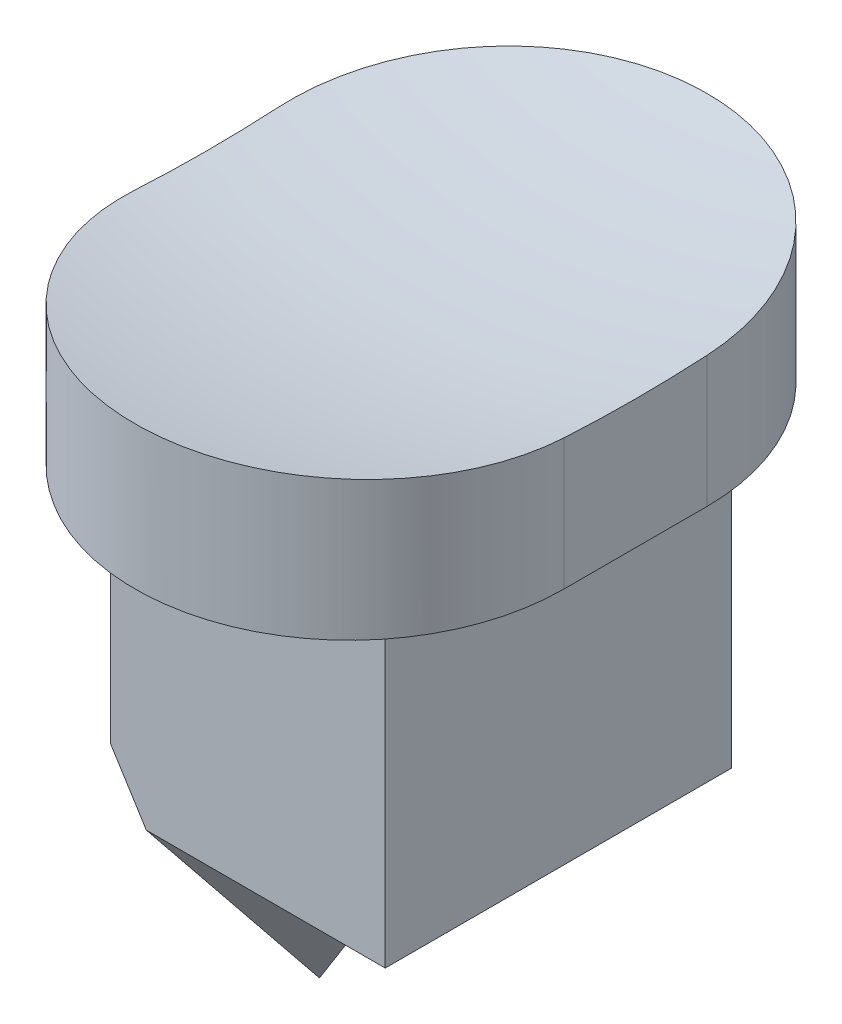
ISO-10303-21;
HEADER;
FILE_DESCRIPTION(('STEP AP214'),'2;1');
FILE_NAME('part.step','',(''),(''),'','','');
FILE_SCHEMA(('AUTOMOTIVE_DESIGN { 1 0 10303 214 1 1 1 1 }'));
ENDSEC;
DATA;
#1=APPLICATION_CONTEXT('core data for automotive mechanical design processes');
#2=APPLICATION_PROTOCOL_DEFINITION('international standard','automotive_design',2000,#1);
#3=PRODUCT_CONTEXT('',#1,'mechanical');
#4=PRODUCT('Part','Part','',(#3));
#5=PRODUCT_RELATED_PRODUCT_CATEGORY('part','',(#4));
#6=PRODUCT_DEFINITION_FORMATION('','',#4);
#7=PRODUCT_DEFINITION_CONTEXT('part definition',#1,'design');
#8=PRODUCT_DEFINITION('design','',#6,#7);
#9=PRODUCT_DEFINITION_SHAPE('','',#8);
#10=(LENGTH_UNIT() NAMED_UNIT(*) SI_UNIT(.MILLI.,.METRE.));
#11=(NAMED_UNIT(*) PLANE_ANGLE_UNIT() SI_UNIT($,.RADIAN.));
#12=(NAMED_UNIT(*) SI_UNIT($,.STERADIAN.) SOLID_ANGLE_UNIT());
#13=UNCERTAINTY_MEASURE_WITH_UNIT(LENGTH_MEASURE(1.E-05),#10,'distance_accuracy_value','');
#14=(GEOMETRIC_REPRESENTATION_CONTEXT(3) GLOBAL_UNCERTAINTY_ASSIGNED_CONTEXT((#13)) GLOBAL_UNIT_ASSIGNED_CONTEXT((#10,
#11,#12)) REPRESENTATION_CONTEXT('',''));
#15=CARTESIAN_POINT('',(0.,0.,0.));
#16=DIRECTION('',(0.,0.,1.));
#17=DIRECTION('',(1.,0.,0.));
#18=AXIS2_PLACEMENT_3D('',#15,#16,#17);
#19=CARTESIAN_POINT('',(0.,0.,0.));
#20=DIRECTION('',(0.,1.,0.));
#21=DIRECTION('',(0.,0.,1.));
#22=AXIS2_PLACEMENT_3D('',#19,#20,#21);
#23=PLANE('',#22);
#24=DIRECTION('',(-0.614212712270394,0.,0.789140509722728));
#25=VECTOR('',#24,1.);
#26=CARTESIAN_POINT('',(1.44339812434811,0.,1.12344185340751));
#27=LINE('',#26,#25);
#28=CARTESIAN_POINT('',(-7.09999999999999,0.,12.1));
#29=VERTEX_POINT('',#28);
#30=CARTESIAN_POINT('',(-1.6,0.,5.03359984779298));
#31=VERTEX_POINT('',#30);
#32=EDGE_CURVE('E67',#29,#31,#27,.F.);
#33=ORIENTED_EDGE('',*,*,#32,.T.);
#34=DIRECTION('',(0.,0.,-1.));
#35=VECTOR('',#34,1.);
#36=CARTESIAN_POINT('',(-1.6,0.,0.));
#37=LINE('',#36,#35);
#38=CARTESIAN_POINT('',(-1.6,0.,1.5));
#39=VERTEX_POINT('',#38);
#40=EDGE_CURVE('E294',#31,#39,#37,.T.);
#41=ORIENTED_EDGE('',*,*,#40,.T.);
#42=DIRECTION('',(-1.,0.,0.));
#43=VECTOR('',#42,1.);
#44=CARTESIAN_POINT('',(-4.6,0.,1.5));
#45=LINE('',#44,#43);
#46=CARTESIAN_POINT('',(9.6,0.,1.5));
#47=VERTEX_POINT('',#46);
#48=EDGE_CURVE('E341',#47,#39,#45,.T.);
#49=ORIENTED_EDGE('',*,*,#48,.F.);
#50=DIRECTION('',(0.,0.,-1.));
#51=VECTOR('',#50,1.);
#52=CARTESIAN_POINT('',(9.6,0.,-12.1));
#53=LINE('',#52,#51);
#54=CARTESIAN_POINT('',(9.6,0.,12.1));
#55=VERTEX_POINT('',#54);
#56=EDGE_CURVE('E214',#55,#47,#53,.T.);
#57=ORIENTED_EDGE('',*,*,#56,.F.);
#58=DIRECTION('',(1.,0.,0.));
#59=VECTOR('',#58,1.);
#60=CARTESIAN_POINT('',(-9.6,0.,12.1));
#61=LINE('',#60,#59);
#62=EDGE_CURVE('E201',#29,#55,#61,.T.);
#63=ORIENTED_EDGE('',*,*,#62,.F.);
#64=EDGE_LOOP('',(#33,#41,#49,#57,#63));
#65=FACE_BOUND('',#64,.T.);
#66=ADVANCED_FACE('F43',(#65),#23,.F.);
#67=CARTESIAN_POINT('',(-4.6,0.,0.));
#68=DIRECTION('',(1.,0.,0.));
#69=DIRECTION('',(0.,0.,-1.));
#70=AXIS2_PLACEMENT_3D('',#67,#68,#69);
#71=PLANE('',#70);
#72=DIRECTION('',(0.,0.778331241018416,-0.627853867754856));
#73=VECTOR('',#72,1.);
#74=CARTESIAN_POINT('',(-4.6,-4.34337251943384,-5.38434609847169));
#75=LINE('',#74,#73);
#76=CARTESIAN_POINT('',(-4.6,-11.0181817324153,0.));
#77=VERTEX_POINT('',#76);
#78=CARTESIAN_POINT('',(-4.6,-3.,-6.46799993081499));
#79=VERTEX_POINT('',#78);
#80=EDGE_CURVE('E255',#77,#79,#75,.T.);
#81=ORIENTED_EDGE('',*,*,#80,.T.);
#82=DIRECTION('',(0.,0.,-1.));
#83=VECTOR('',#82,1.);
#84=CARTESIAN_POINT('',(-4.6,-3.,0.));
#85=LINE('',#84,#83);
#86=CARTESIAN_POINT('',(-4.6,-3.,-1.5));
#87=VERTEX_POINT('',#86);
#88=EDGE_CURVE('E288',#79,#87,#85,.F.);
#89=ORIENTED_EDGE('',*,*,#88,.T.);
#90=DIRECTION('',(0.,-1.,0.));
#91=VECTOR('',#90,1.);
#92=CARTESIAN_POINT('',(-4.6,-5.,-1.5));
#93=LINE('',#92,#91);
#94=CARTESIAN_POINT('',(-4.6,-5.,-1.5));
#95=VERTEX_POINT('',#94);
#96=EDGE_CURVE('E281',#87,#95,#93,.T.);
#97=ORIENTED_EDGE('',*,*,#96,.T.);
#98=DIRECTION('',(0.,0.,-1.));
#99=VECTOR('',#98,1.);
#100=CARTESIAN_POINT('',(-4.6,-5.,1.5));
#101=LINE('',#100,#99);
#102=CARTESIAN_POINT('',(-4.6,-5.,1.5));
#103=VERTEX_POINT('',#102);
#104=EDGE_CURVE('E340',#103,#95,#101,.T.);
#105=ORIENTED_EDGE('',*,*,#104,.F.);
#106=DIRECTION('',(0.,-1.,0.));
#107=VECTOR('',#106,1.);
#108=CARTESIAN_POINT('',(-4.6,-5.,1.5));
#109=LINE('',#108,#107);
#110=CARTESIAN_POINT('',(-4.6,-3.,1.5));
#111=VERTEX_POINT('',#110);
#112=EDGE_CURVE('E326',#111,#103,#109,.T.);
#113=ORIENTED_EDGE('',*,*,#112,.F.);
#114=DIRECTION('',(0.,0.,-1.));
#115=VECTOR('',#114,1.);
#116=CARTESIAN_POINT('',(-4.6,-3.,0.));
#117=LINE('',#116,#115);
#118=CARTESIAN_POINT('',(-4.6,-3.,6.46799993081499));
#119=VERTEX_POINT('',#118);
#120=EDGE_CURVE('E285',#111,#119,#117,.F.);
#121=ORIENTED_EDGE('',*,*,#120,.T.);
#122=DIRECTION('',(0.,-0.778331241018416,-0.627853867754856));
#123=VECTOR('',#122,1.);
#124=CARTESIAN_POINT('',(-4.6,-4.34337251943383,5.3843460984717));
#125=LINE('',#124,#123);
#126=EDGE_CURVE('E252',#119,#77,#125,.T.);
#127=ORIENTED_EDGE('',*,*,#126,.T.);
#128=EDGE_LOOP('',(#81,#89,#97,#105,#113,#121,#127));
#129=FACE_BOUND('',#128,.T.);
#130=ADVANCED_FACE('F309',(#129),#71,.T.);
#131=CARTESIAN_POINT('',(9.6,22.1,-12.1));
#132=DIRECTION('',(-1.,0.,0.));
#133=DIRECTION('',(0.,0.,1.));
#134=AXIS2_PLACEMENT_3D('',#131,#132,#133);
#135=PLANE('',#134);
#136=ORIENTED_EDGE('',*,*,#56,.T.);
#137=DIRECTION('',(0.,0.,-1.));
#138=VECTOR('',#137,1.);
#139=CARTESIAN_POINT('',(9.6,0.,1.5));
#140=LINE('',#139,#138);
#141=CARTESIAN_POINT('',(9.6,0.,-1.5));
#142=VERTEX_POINT('',#141);
#143=EDGE_CURVE('E337',#47,#142,#140,.T.);
#144=ORIENTED_EDGE('',*,*,#143,.T.);
#145=CARTESIAN_POINT('',(9.6,0.,-12.1));
#146=VERTEX_POINT('',#145);
#147=EDGE_CURVE('E195',#142,#146,#53,.T.);
#148=ORIENTED_EDGE('',*,*,#147,.T.);
#149=DIRECTION('',(0.,-1.,0.));
#150=VECTOR('',#149,1.);
#151=CARTESIAN_POINT('',(9.6,22.1,-12.1));
#152=LINE('',#151,#150);
#153=CARTESIAN_POINT('',(9.6,22.1,-12.1));
#154=VERTEX_POINT('',#153);
#155=EDGE_CURVE('E234',#154,#146,#152,.T.);
#156=ORIENTED_EDGE('',*,*,#155,.F.);
#157=DIRECTION('',(0.,0.,-1.));
#158=VECTOR('',#157,1.);
#159=CARTESIAN_POINT('',(9.6,22.1,-12.1));
#160=LINE('',#159,#158);
#161=CARTESIAN_POINT('',(9.6,22.1,12.1));
#162=VERTEX_POINT('',#161);
#163=EDGE_CURVE('E196',#162,#154,#160,.T.);
#164=ORIENTED_EDGE('',*,*,#163,.F.);
#165=DIRECTION('',(0.,-1.,0.));
#166=VECTOR('',#165,1.);
#167=CARTESIAN_POINT('',(9.6,22.1,12.1));
#168=LINE('',#167,#166);
#169=EDGE_CURVE('E213',#162,#55,#168,.T.);
#170=ORIENTED_EDGE('',*,*,#169,.T.);
#171=EDGE_LOOP('',(#136,#144,#148,#156,#164,#170));
#172=FACE_BOUND('',#171,.T.);
#173=ADVANCED_FACE('F408',(#172),#135,.F.);
#174=CARTESIAN_POINT('',(-9.6,22.1,-12.1));
#175=DIRECTION('',(0.,0.,1.));
#176=DIRECTION('',(1.,0.,0.));
#177=AXIS2_PLACEMENT_3D('',#174,#175,#176);
#178=PLANE('',#177);
#179=DIRECTION('',(-1.,0.,0.));
#180=VECTOR('',#179,1.);
#181=CARTESIAN_POINT('',(-9.6,0.,-12.1));
#182=LINE('',#181,#180);
#183=CARTESIAN_POINT('',(-7.1,0.,-12.1));
#184=VERTEX_POINT('',#183);
#185=EDGE_CURVE('E218',#146,#184,#182,.T.);
#186=ORIENTED_EDGE('',*,*,#185,.T.);
#187=DIRECTION('',(-0.531735872516945,0.846910244287223,0.));
#188=VECTOR('',#187,1.);
#189=CARTESIAN_POINT('',(-14.542843763105,11.8544205034841,-12.1));
#190=LINE('',#189,#188);
#191=CARTESIAN_POINT('',(-9.6,3.98181826758472,-12.1));
#192=VERTEX_POINT('',#191);
#193=EDGE_CURVE('E245',#184,#192,#190,.T.);
#194=ORIENTED_EDGE('',*,*,#193,.T.);
#195=DIRECTION('',(0.,-1.,0.));
#196=VECTOR('',#195,1.);
#197=CARTESIAN_POINT('',(-9.6,22.1,-12.1));
#198=LINE('',#197,#196);
#199=CARTESIAN_POINT('',(-9.6,22.1,-12.1));
#200=VERTEX_POINT('',#199);
#201=EDGE_CURVE('E230',#200,#192,#198,.T.);
#202=ORIENTED_EDGE('',*,*,#201,.F.);
#203=DIRECTION('',(-1.,0.,0.));
#204=VECTOR('',#203,1.);
#205=CARTESIAN_POINT('',(-9.6,22.1,-12.1));
#206=LINE('',#205,#204);
#207=EDGE_CURVE('E200',#154,#200,#206,.T.);
#208=ORIENTED_EDGE('',*,*,#207,.F.);
#209=ORIENTED_EDGE('',*,*,#155,.T.);
#210=EDGE_LOOP('',(#186,#194,#202,#208,#209));
#211=FACE_BOUND('',#210,.T.);
#212=ADVANCED_FACE('F401',(#211),#178,.F.);
#213=CARTESIAN_POINT('',(-9.6,22.1,-12.1));
#214=DIRECTION('',(1.,0.,0.));
#215=DIRECTION('',(0.,0.,-1.));
#216=AXIS2_PLACEMENT_3D('',#213,#214,#215);
#217=PLANE('',#216);
#218=ORIENTED_EDGE('',*,*,#201,.T.);
#219=DIRECTION('',(0.,-0.778331241018416,0.627853867754856));
#220=VECTOR('',#219,1.);
#221=CARTESIAN_POINT('',(-9.6,-13.4303653306129,1.94582810254605));
#222=LINE('',#221,#220);
#223=CARTESIAN_POINT('',(-9.6,-11.0181817324153,0.));
#224=VERTEX_POINT('',#223);
#225=EDGE_CURVE('E241',#192,#224,#222,.T.);
#226=ORIENTED_EDGE('',*,*,#225,.T.);
#227=DIRECTION('',(0.,0.778331241018416,0.627853867754856));
#228=VECTOR('',#227,1.);
#229=CARTESIAN_POINT('',(-9.6,1.56963466938714,10.1541718974539));
#230=LINE('',#229,#228);
#231=CARTESIAN_POINT('',(-9.6,3.98181826758473,12.1));
#232=VERTEX_POINT('',#231);
#233=EDGE_CURVE('E238',#224,#232,#230,.T.);
#234=ORIENTED_EDGE('',*,*,#233,.T.);
#235=DIRECTION('',(0.,-1.,0.));
#236=VECTOR('',#235,1.);
#237=CARTESIAN_POINT('',(-9.6,22.1,12.1));
#238=LINE('',#237,#236);
#239=CARTESIAN_POINT('',(-9.6,22.1,12.1));
#240=VERTEX_POINT('',#239);
#241=EDGE_CURVE('E226',#240,#232,#238,.T.);
#242=ORIENTED_EDGE('',*,*,#241,.F.);
#243=DIRECTION('',(0.,0.,1.));
#244=VECTOR('',#243,1.);
#245=CARTESIAN_POINT('',(-9.6,22.1,-12.1));
#246=LINE('',#245,#244);
#247=EDGE_CURVE('E205',#200,#240,#246,.T.);
#248=ORIENTED_EDGE('',*,*,#247,.F.);
#249=EDGE_LOOP('',(#218,#226,#234,#242,#248));
#250=FACE_BOUND('',#249,.T.);
#251=ADVANCED_FACE('F404',(#250),#217,.F.);
#252=CARTESIAN_POINT('',(-9.6,22.1,12.1));
#253=DIRECTION('',(0.,0.,-1.));
#254=DIRECTION('',(-1.,0.,0.));
#255=AXIS2_PLACEMENT_3D('',#252,#253,#254);
#256=PLANE('',#255);
#257=ORIENTED_EDGE('',*,*,#241,.T.);
#258=DIRECTION('',(0.531735872516944,-0.846910244287223,0.));
#259=VECTOR('',#258,1.);
#260=CARTESIAN_POINT('',(-9.21720446114744,3.3721293598435,12.1));
#261=LINE('',#260,#259);
#262=EDGE_CURVE('E248',#232,#29,#261,.T.);
#263=ORIENTED_EDGE('',*,*,#262,.T.);
#264=ORIENTED_EDGE('',*,*,#62,.T.);
#265=ORIENTED_EDGE('',*,*,#169,.F.);
#266=DIRECTION('',(1.,0.,0.));
#267=VECTOR('',#266,1.);
#268=CARTESIAN_POINT('',(-9.6,22.1,12.1));
#269=LINE('',#268,#267);
#270=EDGE_CURVE('E209',#240,#162,#269,.T.);
#271=ORIENTED_EDGE('',*,*,#270,.F.);
#272=EDGE_LOOP('',(#257,#263,#264,#265,#271));
#273=FACE_BOUND('',#272,.T.);
#274=ADVANCED_FACE('F414',(#273),#256,.F.);
#275=DIRECTION('',(-1.,0.,0.));
#276=VECTOR('',#275,1.);
#277=CARTESIAN_POINT('',(-4.6,0.,-1.5));
#278=LINE('',#277,#276);
#279=CARTESIAN_POINT('',(-1.6,0.,-1.5));
#280=VERTEX_POINT('',#279);
#281=EDGE_CURVE('E320',#142,#280,#278,.T.);
#282=ORIENTED_EDGE('',*,*,#281,.T.);
#283=DIRECTION('',(0.,0.,-1.));
#284=VECTOR('',#283,1.);
#285=CARTESIAN_POINT('',(-1.6,0.,0.));
#286=LINE('',#285,#284);
#287=CARTESIAN_POINT('',(-1.6,0.,-5.03359984779297));
#288=VERTEX_POINT('',#287);
#289=EDGE_CURVE('E265',#280,#288,#286,.T.);
#290=ORIENTED_EDGE('',*,*,#289,.T.);
#291=DIRECTION('',(0.614212712270393,0.,0.789140509722728));
#292=VECTOR('',#291,1.);
#293=CARTESIAN_POINT('',(1.4433981243481,0.,-1.12344185340751));
#294=LINE('',#293,#292);
#295=EDGE_CURVE('E259',#288,#184,#294,.F.);
#296=ORIENTED_EDGE('',*,*,#295,.T.);
#297=ORIENTED_EDGE('',*,*,#185,.F.);
#298=ORIENTED_EDGE('',*,*,#147,.F.);
#299=EDGE_LOOP('',(#282,#290,#296,#297,#298));
#300=FACE_BOUND('',#299,.T.);
#301=ADVANCED_FACE('F322',(#300),#23,.F.);
#302=CARTESIAN_POINT('',(0.,22.1,-5.));
#303=DIRECTION('',(0.,1.,0.));
#304=DIRECTION('',(0.,0.,1.));
#305=AXIS2_PLACEMENT_3D('',#302,#303,#304);
#306=PLANE('',#305);
#307=CARTESIAN_POINT('',(0.,22.1,-5.));
#308=DIRECTION('',(0.,1.,0.));
#309=DIRECTION('',(0.,0.,1.));
#310=AXIS2_PLACEMENT_3D('',#307,#308,#309);
#311=CIRCLE('',#310,15.);
#312=CARTESIAN_POINT('',(15.,22.1,-4.99999999999999));
#313=VERTEX_POINT('',#312);
#314=CARTESIAN_POINT('',(-15.,22.1,-4.99999999999999));
#315=VERTEX_POINT('',#314);
#316=EDGE_CURVE('E345',#313,#315,#311,.T.);
#317=ORIENTED_EDGE('',*,*,#316,.F.);
#318=DIRECTION('',(0.,0.,-1.));
#319=VECTOR('',#318,1.);
#320=CARTESIAN_POINT('',(15.,22.1,-4.99999999999999));
#321=LINE('',#320,#319);
#322=CARTESIAN_POINT('',(15.,22.1,4.99999999999999));
#323=VERTEX_POINT('',#322);
#324=EDGE_CURVE('E178',#323,#313,#321,.T.);
#325=ORIENTED_EDGE('',*,*,#324,.F.);
#326=CARTESIAN_POINT('',(0.,22.1,5.));
#327=DIRECTION('',(0.,1.,0.));
#328=DIRECTION('',(0.,0.,1.));
#329=AXIS2_PLACEMENT_3D('',#326,#327,#328);
#330=CIRCLE('',#329,15.);
#331=CARTESIAN_POINT('',(-15.,22.1,4.99999999999998));
#332=VERTEX_POINT('',#331);
#333=EDGE_CURVE('E187',#332,#323,#330,.T.);
#334=ORIENTED_EDGE('',*,*,#333,.F.);
#335=DIRECTION('',(0.,0.,1.));
#336=VECTOR('',#335,1.);
#337=CARTESIAN_POINT('',(-15.,22.1,-4.99999999999999));
#338=LINE('',#337,#336);
#339=EDGE_CURVE('E348',#315,#332,#338,.T.);
#340=ORIENTED_EDGE('',*,*,#339,.F.);
#341=EDGE_LOOP('',(#317,#325,#334,#340));
#342=FACE_BOUND('',#341,.T.);
#343=ORIENTED_EDGE('',*,*,#270,.T.);
#344=ORIENTED_EDGE('',*,*,#163,.T.);
#345=ORIENTED_EDGE('',*,*,#207,.T.);
#346=ORIENTED_EDGE('',*,*,#247,.T.);
#347=EDGE_LOOP('',(#343,#344,#345,#346));
#348=FACE_BOUND('',#347,.T.);
#349=ADVANCED_FACE('F359',(#342,#348),#306,.F.);
#350=CARTESIAN_POINT('',(0.,32.1,-5.));
#351=DIRECTION('',(0.,-1.,0.));
#352=DIRECTION('',(0.,0.,-1.));
#353=AXIS2_PLACEMENT_3D('',#350,#351,#352);
#354=CYLINDRICAL_SURFACE('',#353,15.);
#355=DIRECTION('',(0.,-1.,0.));
#356=VECTOR('',#355,1.);
#357=CARTESIAN_POINT('',(-15.,32.1,-4.99999999999999));
#358=LINE('',#357,#356);
#359=CARTESIAN_POINT('',(-15.,31.2508591590882,-4.99999999999999));
#360=VERTEX_POINT('',#359);
#361=EDGE_CURVE('E166',#360,#315,#358,.T.);
#362=ORIENTED_EDGE('',*,*,#361,.F.);
#363=CARTESIAN_POINT('',(-14.9999999986667,31.2508478913742,-4.99979999999999));
#364=CARTESIAN_POINT('',(-15.0000506391017,31.2746437867831,-5.42217484030273));
#365=CARTESIAN_POINT('',(-14.9821730961957,31.2984490712071,-5.84454306731282));
#366=CARTESIAN_POINT('',(-14.9108868331152,31.3459084374986,-6.68626077643926));
#367=CARTESIAN_POINT('',(-14.8574797063176,31.3695625260987,-7.10561039307723));
#368=CARTESIAN_POINT('',(-14.7155061396955,31.4165362239696,-7.93804979582469));
#369=CARTESIAN_POINT('',(-14.6269628596686,31.4398560431024,-8.35114351963855));
#370=CARTESIAN_POINT('',(-14.4153553718504,31.486010213174,-9.16841442879596));
#371=CARTESIAN_POINT('',(-14.2922916030787,31.5088445702829,-9.57259172746505));
#372=CARTESIAN_POINT('',(-14.0124373949551,31.5538754299442,-10.3693555866454));
#373=CARTESIAN_POINT('',(-13.8556305487538,31.576071616227,-10.7619364026334));
#374=CARTESIAN_POINT('',(-13.5094332810425,31.6196547409993,-11.5325046823114));
#375=CARTESIAN_POINT('',(-13.320042884733,31.6410416801147,-11.9104921572877));
#376=CARTESIAN_POINT('',(-12.9100581798598,31.68284758111,-12.6491025537116));
#377=CARTESIAN_POINT('',(-12.689470265127,31.7032667401913,-13.0097290129944));
#378=CARTESIAN_POINT('',(-12.2186223743029,31.7429937287892,-13.7111238679321));
#379=CARTESIAN_POINT('',(-11.9683625524177,31.7623015640806,-14.0518923667759));
#380=CARTESIAN_POINT('',(-11.4401192392312,31.7996531300898,-14.7109160661271));
#381=CARTESIAN_POINT('',(-11.1621544146547,31.8176976981867,-15.0291861814779));
#382=CARTESIAN_POINT('',(-10.5803298451698,31.8524054838825,-15.6411882275958));
#383=CARTESIAN_POINT('',(-10.2764700618578,31.8690686994327,-15.9349201219702));
#384=CARTESIAN_POINT('',(-9.64496496870231,31.9008942895023,-16.4957826384666));
#385=CARTESIAN_POINT('',(-9.31731614148747,31.9160564412927,-16.7629093129212));
#386=CARTESIAN_POINT('',(-8.64060205937951,31.9447658485236,-17.2685944663052));
#387=CARTESIAN_POINT('',(-8.29153683779169,31.9583131064755,-17.50715298966));
#388=CARTESIAN_POINT('',(-7.57503358554768,31.9836732888135,-17.9536392885165));
#389=CARTESIAN_POINT('',(-7.20762500553362,31.9954888805376,-18.1616141746302));
#390=CARTESIAN_POINT('',(-6.45654677835548,32.0173239296959,-18.5458830772722));
#391=CARTESIAN_POINT('',(-6.07287714528212,32.0273433886866,-18.7221771212523));
#392=CARTESIAN_POINT('',(-5.2920350788364,32.04551165217,-19.0418062049738));
#393=CARTESIAN_POINT('',(-4.89486360411375,32.0536605891553,-19.185143579098));
#394=CARTESIAN_POINT('',(-4.08982177308722,32.068028511868,-19.4378441872535));
#395=CARTESIAN_POINT('',(-3.68195142651031,32.0742474993498,-19.5472074521714));
#396=CARTESIAN_POINT('',(-2.85900306058169,32.0847021090016,-19.7310424059117));
#397=CARTESIAN_POINT('',(-2.44393604770118,32.0889405230578,-19.8055632099809));
#398=CARTESIAN_POINT('',(-1.60898739607951,32.0954156619591,-19.9194062863677));
#399=CARTESIAN_POINT('',(-1.18910576194394,32.0976523887189,-19.9587285923526));
#400=CARTESIAN_POINT('',(-0.347509153550529,32.1001076406264,-20.0018924726644));
#401=CARTESIAN_POINT('',(0.0742058541473862,32.1003261288064,-20.0057333970839));
#402=CARTESIAN_POINT('',(0.916458785104859,32.0987431909351,-19.9779052008671));
#403=CARTESIAN_POINT('',(1.33699670862749,32.0969417653352,-19.9462360881677));
#404=CARTESIAN_POINT('',(2.17359869827455,32.0913343532475,-19.8476512040482));
#405=CARTESIAN_POINT('',(2.5896657773283,32.0875298160423,-19.7807609156991));
#406=CARTESIAN_POINT('',(3.41467769821578,32.0779451310359,-19.6122290551714));
#407=CARTESIAN_POINT('',(3.82362254463179,32.0721649845058,-19.5105875053519));
#408=CARTESIAN_POINT('',(4.63148438746042,32.0586717097017,-19.2732824006717));
#409=CARTESIAN_POINT('',(5.03040141896515,32.0509585881932,-19.1376189648881));
#410=CARTESIAN_POINT('',(5.81537866039136,32.0336561159276,-18.8332418454308));
#411=CARTESIAN_POINT('',(6.20143886475193,32.0240667643591,-18.6645281474624));
#412=CARTESIAN_POINT('',(6.95810084038341,32.0030785237844,-18.2951920805269));
#413=CARTESIAN_POINT('',(7.32869705557464,31.9916789913457,-18.0945583654748));
#414=CARTESIAN_POINT('',(8.05165993876814,31.9671564312873,-17.6628603469384));
#415=CARTESIAN_POINT('',(8.404026599352,31.9540334029664,-17.4317960310707));
#416=CARTESIAN_POINT('',(9.08802243523577,31.9261604512782,-16.9408981280067));
#417=CARTESIAN_POINT('',(9.41965254070058,31.9114106009664,-16.6810658326858));
#418=CARTESIAN_POINT('',(10.0598501237895,31.880391089213,-16.1344765878688));
#419=CARTESIAN_POINT('',(10.3684176225188,31.8641214291623,-15.8477196630126));
#420=CARTESIAN_POINT('',(10.9606362918341,31.8301620889387,-15.2489971272065));
#421=CARTESIAN_POINT('',(11.2442600575619,31.8124708867972,-14.9370044953095));
#422=CARTESIAN_POINT('',(11.7842161351659,31.7758121380312,-14.2903011984426));
#423=CARTESIAN_POINT('',(12.0405482240919,31.756844580982,-13.9555903479205));
#424=CARTESIAN_POINT('',(12.5241941904054,31.7177638994817,-13.2657170974922));
#425=CARTESIAN_POINT('',(12.7514982993575,31.6976503926735,-12.9105478710135));
#426=CARTESIAN_POINT('',(13.1753814256011,31.6564293212802,-12.1823944441116));
#427=CARTESIAN_POINT('',(13.3719613450236,31.6353217859057,-11.8094107671806));
#428=CARTESIAN_POINT('',(13.7334187069702,31.5922166421547,-11.0474307227759));
#429=CARTESIAN_POINT('',(13.898225713827,31.5702171841741,-10.6584010479303));
#430=CARTESIAN_POINT('',(14.1944376522535,31.5255299262867,-9.86786443419367));
#431=CARTESIAN_POINT('',(14.3258427385919,31.5028421295699,-9.46635755312584));
#432=CARTESIAN_POINT('',(14.5541795915039,31.4569709199246,-8.65425267341399));
#433=CARTESIAN_POINT('',(14.6511551873981,31.433788177239,-8.24366694515202));
#434=CARTESIAN_POINT('',(14.810150084911,31.3870729303193,-7.41597012269038));
#435=CARTESIAN_POINT('',(14.8721864814164,31.3635406029231,-6.99886232243225));
#436=CARTESIAN_POINT('',(14.9443765713797,31.3251061987872,-6.31734289546333));
#437=CARTESIAN_POINT('',(14.9652518042449,31.3102596304137,-6.05401737792478));
#438=CARTESIAN_POINT('',(14.9930552524699,31.2805572761699,-5.52707036300301));
#439=CARTESIAN_POINT('',(15.0000065081626,31.2657015462837,-5.26345007800046));
#440=CARTESIAN_POINT('',(14.9999999986667,31.2508478913742,-4.99979999999999));
#441=B_SPLINE_CURVE_WITH_KNOTS('',3,(#363,#364,#365,#366,#367,#368,#369,#370,#371,#372,#373,
#374,#375,#376,#377,#378,#379,#380,#381,#382,#383,#384,#385,#386,#387,#388,#389,#390,#391,#392,
#393,#394,#395,#396,#397,#398,#399,#400,#401,#402,#403,#404,#405,#406,#407,#408,#409,#410,#411,
#412,#413,#414,#415,#416,#417,#418,#419,#420,#421,#422,#423,#424,#425,#426,#427,#428,#429,#430,
#431,#432,#433,#434,#435,#436,#437,#438,#439,#440),.UNSPECIFIED.,.F.,.F.,(4,2,2,2,2,2,2,2,2,2,2,
2,2,2,2,2,2,2,2,2,2,2,2,2,2,2,2,2,2,2,2,2,2,2,2,2,2,2,4),(0.,1.26874718073188,2.53743746645131,
3.80529288746934,5.07313218506694,6.34158934095394,7.61004551580619,8.87824210036107,
10.1464320943313,11.413773326437,12.6811164381088,13.9486473181495,15.216176227063,
16.4817317265124,17.7472861293401,19.0127508629334,20.2782144460599,21.5418887654559,
22.8055618761451,24.0692581333059,25.3329541080149,26.595737032714,27.8585191449388,
29.12129683747,30.3840750761763,31.6473031809484,32.9105317997797,34.1737037141552,
35.4368744725583,36.7014161360208,37.9659681289382,39.2309445511509,40.4958838238428,
41.7635958161607,43.0313019343948,44.2973884054922,45.5628548724228,46.3562225770235,
47.1482763893043),.UNSPECIFIED.);
#442=CARTESIAN_POINT('',(15.,31.2508591590882,-4.99999999999999));
#443=VERTEX_POINT('',#442);
#444=EDGE_CURVE('E160',#360,#443,#441,.T.);
#445=ORIENTED_EDGE('',*,*,#444,.T.);
#446=DIRECTION('',(0.,-1.,0.));
#447=VECTOR('',#446,1.);
#448=CARTESIAN_POINT('',(15.,32.1,-4.99999999999999));
#449=LINE('',#448,#447);
#450=EDGE_CURVE('E164',#443,#313,#449,.T.);
#451=ORIENTED_EDGE('',*,*,#450,.T.);
#452=ORIENTED_EDGE('',*,*,#316,.T.);
#453=EDGE_LOOP('',(#362,#445,#451,#452));
#454=FACE_BOUND('',#453,.T.);
#455=ADVANCED_FACE('F161',(#454),#354,.T.);
#456=CARTESIAN_POINT('',(-15.,32.1,-4.99999999999999));
#457=DIRECTION('',(1.,0.,0.));
#458=DIRECTION('',(0.,0.,-1.));
#459=AXIS2_PLACEMENT_3D('',#456,#457,#458);
#460=PLANE('',#459);
#461=DIRECTION('',(0.,-1.,0.));
#462=VECTOR('',#461,1.);
#463=CARTESIAN_POINT('',(-15.,32.1,4.99999999999998));
#464=LINE('',#463,#462);
#465=CARTESIAN_POINT('',(-15.,31.2508591590882,4.99999999999999));
#466=VERTEX_POINT('',#465);
#467=EDGE_CURVE('E185',#466,#332,#464,.T.);
#468=ORIENTED_EDGE('',*,*,#467,.F.);
#469=CARTESIAN_POINT('',(-15.,120.,0.));
#470=DIRECTION('',(1.,0.,0.));
#471=DIRECTION('',(0.,0.,-1.));
#472=AXIS2_PLACEMENT_3D('',#469,#470,#471);
#473=CIRCLE('',#472,88.889875688967);
#474=EDGE_CURVE('E270',#466,#360,#473,.T.);
#475=ORIENTED_EDGE('',*,*,#474,.T.);
#476=ORIENTED_EDGE('',*,*,#361,.T.);
#477=ORIENTED_EDGE('',*,*,#339,.T.);
#478=EDGE_LOOP('',(#468,#475,#476,#477));
#479=FACE_BOUND('',#478,.T.);
#480=ADVANCED_FACE('F362',(#479),#460,.F.);
#481=CARTESIAN_POINT('',(0.,32.1,5.));
#482=DIRECTION('',(0.,-1.,0.));
#483=DIRECTION('',(0.,0.,-1.));
#484=AXIS2_PLACEMENT_3D('',#481,#482,#483);
#485=CYLINDRICAL_SURFACE('',#484,15.);
#486=DIRECTION('',(0.,-1.,0.));
#487=VECTOR('',#486,1.);
#488=CARTESIAN_POINT('',(15.,32.1,4.99999999999999));
#489=LINE('',#488,#487);
#490=CARTESIAN_POINT('',(15.,31.2508591590882,4.99999999999999));
#491=VERTEX_POINT('',#490);
#492=EDGE_CURVE('E181',#491,#323,#489,.T.);
#493=ORIENTED_EDGE('',*,*,#492,.F.);
#494=CARTESIAN_POINT('',(14.9999999986667,31.2508478913742,4.99979999999998));
#495=CARTESIAN_POINT('',(15.0000506391017,31.2746437867831,5.42217484030273));
#496=CARTESIAN_POINT('',(14.9821730961957,31.2984490712071,5.84454306731282));
#497=CARTESIAN_POINT('',(14.9108868331152,31.3459084374986,6.68626077643926));
#498=CARTESIAN_POINT('',(14.8574797063176,31.3695625260987,7.10561039307722));
#499=CARTESIAN_POINT('',(14.7155061396955,31.4165362239696,7.93804979582468));
#500=CARTESIAN_POINT('',(14.6269628596686,31.4398560431024,8.35114351963854));
#501=CARTESIAN_POINT('',(14.4153553718504,31.486010213174,9.16841442879596));
#502=CARTESIAN_POINT('',(14.2922916030787,31.5088445702829,9.57259172746505));
#503=CARTESIAN_POINT('',(14.0124373949551,31.5538754299442,10.3693555866454));
#504=CARTESIAN_POINT('',(13.8556305487538,31.576071616227,10.7619364026334));
#505=CARTESIAN_POINT('',(13.5094332810425,31.6196547409993,11.5325046823114));
#506=CARTESIAN_POINT('',(13.320042884733,31.6410416801147,11.9104921572877));
#507=CARTESIAN_POINT('',(12.9100581798598,31.68284758111,12.6491025537116));
#508=CARTESIAN_POINT('',(12.689470265127,31.7032667401913,13.0097290129944));
#509=CARTESIAN_POINT('',(12.2186223743029,31.7429937287892,13.7111238679321));
#510=CARTESIAN_POINT('',(11.9683625524177,31.7623015640806,14.0518923667759));
#511=CARTESIAN_POINT('',(11.4401192392312,31.7996531300898,14.7109160661271));
#512=CARTESIAN_POINT('',(11.1621544146547,31.8176976981867,15.0291861814778));
#513=CARTESIAN_POINT('',(10.5803298451698,31.8524054838825,15.6411882275958));
#514=CARTESIAN_POINT('',(10.2764700618578,31.8690686994327,15.9349201219702));
#515=CARTESIAN_POINT('',(9.64496496870231,31.9008942895023,16.4957826384666));
#516=CARTESIAN_POINT('',(9.31731614148747,31.9160564412927,16.7629093129212));
#517=CARTESIAN_POINT('',(8.64060205937951,31.9447658485236,17.2685944663052));
#518=CARTESIAN_POINT('',(8.29153683779169,31.9583131064755,17.50715298966));
#519=CARTESIAN_POINT('',(7.57503358554768,31.9836732888135,17.9536392885165));
#520=CARTESIAN_POINT('',(7.20762500553362,31.9954888805376,18.1616141746302));
#521=CARTESIAN_POINT('',(6.45654677835548,32.0173239296959,18.5458830772722));
#522=CARTESIAN_POINT('',(6.07287714528212,32.0273433886866,18.7221771212523));
#523=CARTESIAN_POINT('',(5.2920350788364,32.04551165217,19.0418062049738));
#524=CARTESIAN_POINT('',(4.89486360411375,32.0536605891553,19.185143579098));
#525=CARTESIAN_POINT('',(4.08982177308722,32.068028511868,19.4378441872535));
#526=CARTESIAN_POINT('',(3.68195142651031,32.0742474993498,19.5472074521714));
#527=CARTESIAN_POINT('',(2.85900306058169,32.0847021090016,19.7310424059117));
#528=CARTESIAN_POINT('',(2.44393604770118,32.0889405230578,19.8055632099809));
#529=CARTESIAN_POINT('',(1.60898739607951,32.0954156619591,19.9194062863677));
#530=CARTESIAN_POINT('',(1.18910576194393,32.0976523887189,19.9587285923526));
#531=CARTESIAN_POINT('',(0.347509153550527,32.1001076406264,20.0018924726644));
#532=CARTESIAN_POINT('',(-0.0742058541473885,32.1003261288064,20.0057333970839));
#533=CARTESIAN_POINT('',(-0.916458785104861,32.0987431909351,19.9779052008671));
#534=CARTESIAN_POINT('',(-1.33699670862749,32.0969417653352,19.9462360881677));
#535=CARTESIAN_POINT('',(-2.17359869827456,32.0913343532475,19.8476512040482));
#536=CARTESIAN_POINT('',(-2.58966577732831,32.0875298160423,19.7807609156991));
#537=CARTESIAN_POINT('',(-3.41467769821579,32.0779451310359,19.6122290551714));
#538=CARTESIAN_POINT('',(-3.82362254463179,32.0721649845058,19.5105875053519));
#539=CARTESIAN_POINT('',(-4.63148438746042,32.0586717097017,19.2732824006717));
#540=CARTESIAN_POINT('',(-5.03040141896516,32.0509585881932,19.1376189648881));
#541=CARTESIAN_POINT('',(-5.81537866039136,32.0336561159276,18.8332418454308));
#542=CARTESIAN_POINT('',(-6.20143886475193,32.0240667643591,18.6645281474624));
#543=CARTESIAN_POINT('',(-6.95810084038342,32.0030785237844,18.2951920805269));
#544=CARTESIAN_POINT('',(-7.32869705557465,31.9916789913456,18.0945583654748));
#545=CARTESIAN_POINT('',(-8.05165993876814,31.9671564312873,17.6628603469384));
#546=CARTESIAN_POINT('',(-8.40402659935201,31.9540334029664,17.4317960310707));
#547=CARTESIAN_POINT('',(-9.08802243523578,31.9261604512782,16.9408981280067));
#548=CARTESIAN_POINT('',(-9.41965254070058,31.9114106009664,16.6810658326858));
#549=CARTESIAN_POINT('',(-10.0598501237895,31.880391089213,16.1344765878688));
#550=CARTESIAN_POINT('',(-10.3684176225188,31.8641214291623,15.8477196630126));
#551=CARTESIAN_POINT('',(-10.9606362918341,31.8301620889387,15.2489971272065));
#552=CARTESIAN_POINT('',(-11.2442600575619,31.8124708867972,14.9370044953095));
#553=CARTESIAN_POINT('',(-11.7842161351659,31.7758121380312,14.2903011984426));
#554=CARTESIAN_POINT('',(-12.0405482240919,31.756844580982,13.9555903479205));
#555=CARTESIAN_POINT('',(-12.5241941904054,31.7177638994817,13.2657170974922));
#556=CARTESIAN_POINT('',(-12.7514982993575,31.6976503926735,12.9105478710135));
#557=CARTESIAN_POINT('',(-13.1753814256011,31.6564293212802,12.1823944441116));
#558=CARTESIAN_POINT('',(-13.3719613450236,31.6353217859057,11.8094107671806));
#559=CARTESIAN_POINT('',(-13.7334187069702,31.5922166421547,11.0474307227759));
#560=CARTESIAN_POINT('',(-13.898225713827,31.5702171841741,10.6584010479303));
#561=CARTESIAN_POINT('',(-14.1944376522535,31.5255299262867,9.86786443419366));
#562=CARTESIAN_POINT('',(-14.3258427385919,31.5028421295699,9.46635755312583));
#563=CARTESIAN_POINT('',(-14.5541795915039,31.4569709199246,8.65425267341399));
#564=CARTESIAN_POINT('',(-14.6511551873981,31.433788177239,8.24366694515202));
#565=CARTESIAN_POINT('',(-14.810150084911,31.3870729303193,7.41597012269038));
#566=CARTESIAN_POINT('',(-14.8721864814164,31.3635406029231,6.99886232243225));
#567=CARTESIAN_POINT('',(-14.9443765713797,31.3251061987872,6.31734289546333));
#568=CARTESIAN_POINT('',(-14.9652518042449,31.3102596304137,6.05401737792478));
#569=CARTESIAN_POINT('',(-14.9930552524699,31.2805572761699,5.527070363003));
#570=CARTESIAN_POINT('',(-15.0000065081626,31.2657015462837,5.26345007800046));
#571=CARTESIAN_POINT('',(-14.9999999986667,31.2508478913742,4.99979999999998));
#572=B_SPLINE_CURVE_WITH_KNOTS('',3,(#494,#495,#496,#497,#498,#499,#500,#501,#502,#503,#504,
#505,#506,#507,#508,#509,#510,#511,#512,#513,#514,#515,#516,#517,#518,#519,#520,#521,#522,#523,
#524,#525,#526,#527,#528,#529,#530,#531,#532,#533,#534,#535,#536,#537,#538,#539,#540,#541,#542,
#543,#544,#545,#546,#547,#548,#549,#550,#551,#552,#553,#554,#555,#556,#557,#558,#559,#560,#561,
#562,#563,#564,#565,#566,#567,#568,#569,#570,#571),.UNSPECIFIED.,.F.,.F.,(4,2,2,2,2,2,2,2,2,2,2,
2,2,2,2,2,2,2,2,2,2,2,2,2,2,2,2,2,2,2,2,2,2,2,2,2,2,2,4),(0.,1.26874718073188,2.53743746645131,
3.80529288746934,5.07313218506694,6.34158934095394,7.61004551580619,8.87824210036107,
10.1464320943313,11.413773326437,12.6811164381088,13.9486473181495,15.216176227063,
16.4817317265124,17.7472861293401,19.0127508629334,20.2782144460599,21.5418887654559,
22.8055618761451,24.0692581333059,25.3329541080149,26.595737032714,27.8585191449388,
29.12129683747,30.3840750761763,31.6473031809484,32.9105317997797,34.1737037141552,
35.4368744725583,36.7014161360208,37.9659681289382,39.2309445511509,40.4958838238428,
41.7635958161607,43.0313019343948,44.2973884054922,45.5628548724229,46.3562225770235,
47.1482763893043),.UNSPECIFIED.);
#573=EDGE_CURVE('E59',#491,#466,#572,.T.);
#574=ORIENTED_EDGE('',*,*,#573,.T.);
#575=ORIENTED_EDGE('',*,*,#467,.T.);
#576=ORIENTED_EDGE('',*,*,#333,.T.);
#577=EDGE_LOOP('',(#493,#574,#575,#576));
#578=FACE_BOUND('',#577,.T.);
#579=ADVANCED_FACE('F355',(#578),#485,.T.);
#580=CARTESIAN_POINT('',(15.,32.1,-4.99999999999999));
#581=DIRECTION('',(-1.,0.,0.));
#582=DIRECTION('',(0.,0.,1.));
#583=AXIS2_PLACEMENT_3D('',#580,#581,#582);
#584=PLANE('',#583);
#585=ORIENTED_EDGE('',*,*,#450,.F.);
#586=CARTESIAN_POINT('',(15.,120.,0.));
#587=DIRECTION('',(-1.,0.,0.));
#588=DIRECTION('',(0.,0.,1.));
#589=AXIS2_PLACEMENT_3D('',#586,#587,#588);
#590=CIRCLE('',#589,88.889875688967);
#591=EDGE_CURVE('E169',#443,#491,#590,.T.);
#592=ORIENTED_EDGE('',*,*,#591,.T.);
#593=ORIENTED_EDGE('',*,*,#492,.T.);
#594=ORIENTED_EDGE('',*,*,#324,.T.);
#595=EDGE_LOOP('',(#585,#592,#593,#594));
#596=FACE_BOUND('',#595,.T.);
#597=ADVANCED_FACE('F176',(#596),#584,.F.);
#598=CARTESIAN_POINT('',(-4.6,-5.,1.5));
#599=DIRECTION('',(-0.332125119423911,0.943235339163908,0.));
#600=DIRECTION('',(-0.943235339163908,-0.332125119423911,0.));
#601=AXIS2_PLACEMENT_3D('',#598,#599,#600);
#602=PLANE('',#601);
#603=DIRECTION('',(0.943235339163908,0.332125119423911,0.));
#604=VECTOR('',#603,1.);
#605=CARTESIAN_POINT('',(-4.6,-5.,-1.5));
#606=LINE('',#605,#604);
#607=EDGE_CURVE('E327',#95,#142,#606,.T.);
#608=ORIENTED_EDGE('',*,*,#607,.T.);
#609=ORIENTED_EDGE('',*,*,#143,.F.);
#610=DIRECTION('',(0.943235339163908,0.332125119423911,0.));
#611=VECTOR('',#610,1.);
#612=CARTESIAN_POINT('',(-4.6,-5.,1.5));
#613=LINE('',#612,#611);
#614=EDGE_CURVE('E331',#103,#47,#613,.T.);
#615=ORIENTED_EDGE('',*,*,#614,.F.);
#616=ORIENTED_EDGE('',*,*,#104,.T.);
#617=EDGE_LOOP('',(#608,#609,#615,#616));
#618=FACE_BOUND('',#617,.T.);
#619=ADVANCED_FACE('F385',(#618),#602,.F.);
#620=CARTESIAN_POINT('',(0.,0.,1.5));
#621=DIRECTION('',(0.,0.,-1.));
#622=DIRECTION('',(-1.,0.,0.));
#623=AXIS2_PLACEMENT_3D('',#620,#621,#622);
#624=PLANE('',#623);
#625=ORIENTED_EDGE('',*,*,#48,.T.);
#626=CARTESIAN_POINT('',(-1.6,-3.,1.5));
#627=DIRECTION('',(0.,0.,-1.));
#628=DIRECTION('',(-1.,0.,0.));
#629=AXIS2_PLACEMENT_3D('',#626,#627,#628);
#630=CIRCLE('',#629,3.);
#631=EDGE_CURVE('E297',#39,#111,#630,.F.);
#632=ORIENTED_EDGE('',*,*,#631,.T.);
#633=ORIENTED_EDGE('',*,*,#112,.T.);
#634=ORIENTED_EDGE('',*,*,#614,.T.);
#635=EDGE_LOOP('',(#625,#632,#633,#634));
#636=FACE_BOUND('',#635,.T.);
#637=ADVANCED_FACE('F387',(#636),#624,.F.);
#638=CARTESIAN_POINT('',(0.,0.,-1.5));
#639=DIRECTION('',(0.,0.,-1.));
#640=DIRECTION('',(-1.,0.,0.));
#641=AXIS2_PLACEMENT_3D('',#638,#639,#640);
#642=PLANE('',#641);
#643=ORIENTED_EDGE('',*,*,#96,.F.);
#644=CARTESIAN_POINT('',(-1.6,-3.,-1.5));
#645=DIRECTION('',(0.,0.,-1.));
#646=DIRECTION('',(-1.,0.,0.));
#647=AXIS2_PLACEMENT_3D('',#644,#645,#646);
#648=CIRCLE('',#647,3.);
#649=EDGE_CURVE('E291',#87,#280,#648,.T.);
#650=ORIENTED_EDGE('',*,*,#649,.T.);
#651=ORIENTED_EDGE('',*,*,#281,.F.);
#652=ORIENTED_EDGE('',*,*,#607,.F.);
#653=EDGE_LOOP('',(#643,#650,#651,#652));
#654=FACE_BOUND('',#653,.T.);
#655=ADVANCED_FACE('F318',(#654),#642,.T.);
#656=CARTESIAN_POINT('',(-7.09999999999999,-15.,0.));
#657=DIRECTION('',(-0.707106781186549,0.443959727483659,-0.550363298533462));
#658=DIRECTION('',(0.,0.778331241018416,0.627853867754856));
#659=AXIS2_PLACEMENT_3D('',#656,#657,#658);
#660=PLANE('',#659);
#661=DIRECTION('',(0.531735872516941,0.846910244287225,0.));
#662=VECTOR('',#661,1.);
#663=CARTESIAN_POINT('',(-7.09999999999999,-15.,0.));
#664=LINE('',#663,#662);
#665=CARTESIAN_POINT('',(-7.09999999999998,-15.,0.));
#666=VERTEX_POINT('',#665);
#667=EDGE_CURVE('E278',#77,#666,#664,.F.);
#668=ORIENTED_EDGE('',*,*,#667,.F.);
#669=ORIENTED_EDGE('',*,*,#126,.F.);
#670=CARTESIAN_POINT('',(-1.6,-3.,2.61359984779298));
#671=DIRECTION('',(-0.707106781186549,0.443959727483659,-0.550363298533462));
#672=DIRECTION('',(0.466108315607697,-0.292647908746993,-0.834925289847761));
#673=AXIS2_PLACEMENT_3D('',#670,#671,#672);
#674=ELLIPSE('',#673,5.45094487222171,3.);
#675=EDGE_CURVE('E11',#119,#31,#674,.T.);
#676=ORIENTED_EDGE('',*,*,#675,.T.);
#677=ORIENTED_EDGE('',*,*,#32,.F.);
#678=DIRECTION('',(0.,0.778331241018416,0.627853867754856));
#679=VECTOR('',#678,1.);
#680=CARTESIAN_POINT('',(-7.09999999999999,-15.,0.));
#681=LINE('',#680,#679);
#682=EDGE_CURVE('E274',#666,#29,#681,.T.);
#683=ORIENTED_EDGE('',*,*,#682,.F.);
#684=EDGE_LOOP('',(#668,#669,#676,#677,#683));
#685=FACE_BOUND('',#684,.T.);
#686=ADVANCED_FACE('F393',(#685),#660,.F.);
#687=CARTESIAN_POINT('',(-7.1,0.,-12.1));
#688=DIRECTION('',(-0.707106781186549,0.443959727483659,0.550363298533462));
#689=DIRECTION('',(0.,-0.778331241018416,0.627853867754856));
#690=AXIS2_PLACEMENT_3D('',#687,#688,#689);
#691=PLANE('',#690);
#692=ORIENTED_EDGE('',*,*,#80,.F.);
#693=ORIENTED_EDGE('',*,*,#667,.T.);
#694=DIRECTION('',(0.,-0.778331241018416,0.627853867754856));
#695=VECTOR('',#694,1.);
#696=CARTESIAN_POINT('',(-7.1,0.,-12.1));
#697=LINE('',#696,#695);
#698=EDGE_CURVE('E269',#184,#666,#697,.T.);
#699=ORIENTED_EDGE('',*,*,#698,.F.);
#700=ORIENTED_EDGE('',*,*,#295,.F.);
#701=CARTESIAN_POINT('',(-1.6,-3.,-2.61359984779297));
#702=DIRECTION('',(-0.707106781186549,0.443959727483659,0.550363298533462));
#703=DIRECTION('',(-0.466108315607697,0.292647908746992,-0.834925289847761));
#704=AXIS2_PLACEMENT_3D('',#701,#702,#703);
#705=ELLIPSE('',#704,5.45094487222171,3.);
#706=EDGE_CURVE('E52',#288,#79,#705,.T.);
#707=ORIENTED_EDGE('',*,*,#706,.T.);
#708=EDGE_LOOP('',(#692,#693,#699,#700,#707));
#709=FACE_BOUND('',#708,.T.);
#710=ADVANCED_FACE('F303',(#709),#691,.F.);
#711=CARTESIAN_POINT('',(-9.6,3.13178970021562,11.4143102889889));
#712=DIRECTION('',(-0.707106781186546,-0.443959727483661,0.550363298533465));
#713=DIRECTION('',(0.,-0.778331241018416,-0.627853867754856));
#714=AXIS2_PLACEMENT_3D('',#711,#712,#713);
#715=PLANE('',#714);
#716=ORIENTED_EDGE('',*,*,#262,.F.);
#717=ORIENTED_EDGE('',*,*,#233,.F.);
#718=DIRECTION('',(0.531735872516945,-0.846910244287223,0.));
#719=VECTOR('',#718,1.);
#720=CARTESIAN_POINT('',(-15.9721928264915,-0.869016211976857,0.));
#721=LINE('',#720,#719);
#722=EDGE_CURVE('E266',#666,#224,#721,.F.);
#723=ORIENTED_EDGE('',*,*,#722,.F.);
#724=ORIENTED_EDGE('',*,*,#682,.T.);
#725=EDGE_LOOP('',(#716,#717,#723,#724));
#726=FACE_BOUND('',#725,.T.);
#727=ADVANCED_FACE('F417',(#726),#715,.T.);
#728=CARTESIAN_POINT('',(-9.6,14.9578040778576,-20.9539618869534));
#729=DIRECTION('',(-0.707106781186546,-0.443959727483662,-0.550363298533465));
#730=DIRECTION('',(0.,0.778331241018416,-0.627853867754856));
#731=AXIS2_PLACEMENT_3D('',#728,#729,#730);
#732=PLANE('',#731);
#733=ORIENTED_EDGE('',*,*,#193,.F.);
#734=ORIENTED_EDGE('',*,*,#698,.T.);
#735=ORIENTED_EDGE('',*,*,#722,.T.);
#736=ORIENTED_EDGE('',*,*,#225,.F.);
#737=EDGE_LOOP('',(#733,#734,#735,#736));
#738=FACE_BOUND('',#737,.T.);
#739=ADVANCED_FACE('F399',(#738),#732,.T.);
#740=CARTESIAN_POINT('',(-1.6,-3.,0.));
#741=DIRECTION('',(0.,0.,-1.));
#742=DIRECTION('',(-1.,0.,0.));
#743=AXIS2_PLACEMENT_3D('',#740,#741,#742);
#744=CYLINDRICAL_SURFACE('',#743,3.);
#745=ORIENTED_EDGE('',*,*,#649,.F.);
#746=ORIENTED_EDGE('',*,*,#88,.F.);
#747=ORIENTED_EDGE('',*,*,#706,.F.);
#748=ORIENTED_EDGE('',*,*,#289,.F.);
#749=EDGE_LOOP('',(#745,#746,#747,#748));
#750=FACE_BOUND('',#749,.T.);
#751=ADVANCED_FACE('F314',(#750),#744,.F.);
#752=CARTESIAN_POINT('',(-1.6,-3.,0.));
#753=DIRECTION('',(0.,0.,-1.));
#754=DIRECTION('',(-1.,0.,0.));
#755=AXIS2_PLACEMENT_3D('',#752,#753,#754);
#756=CYLINDRICAL_SURFACE('',#755,3.);
#757=ORIENTED_EDGE('',*,*,#675,.F.);
#758=ORIENTED_EDGE('',*,*,#120,.F.);
#759=ORIENTED_EDGE('',*,*,#631,.F.);
#760=ORIENTED_EDGE('',*,*,#40,.F.);
#761=EDGE_LOOP('',(#757,#758,#759,#760));
#762=FACE_BOUND('',#761,.T.);
#763=ADVANCED_FACE('F45',(#762),#756,.F.);
#764=CARTESIAN_POINT('',(0.,120.,0.));
#765=DIRECTION('',(0.,0.,1.));
#766=DIRECTION('',(0.,1.,0.));
#767=AXIS2_PLACEMENT_3D('',#764,#765,#766);
#768=SPHERICAL_SURFACE('',#767,90.146602820073);
#769=ORIENTED_EDGE('',*,*,#573,.F.);
#770=ORIENTED_EDGE('',*,*,#591,.F.);
#771=ORIENTED_EDGE('',*,*,#444,.F.);
#772=ORIENTED_EDGE('',*,*,#474,.F.);
#773=EDGE_LOOP('',(#769,#770,#771,#772));
#774=FACE_BOUND('',#773,.T.);
#775=ADVANCED_FACE('F171',(#774),#768,.F.);
#776=CLOSED_SHELL('',(#66,#130,#173,#212,#251,#274,#301,#349,#455,#480,#579,#597,#619,#637,#655,
#686,#710,#727,#739,#751,#763,#775));
#777=MANIFOLD_SOLID_BREP('B2',#776);
#778=ADVANCED_BREP_SHAPE_REPRESENTATION('',(#18,#777),#14);
#779=SHAPE_DEFINITION_REPRESENTATION(#9,#778);
ENDSEC;
END-ISO-10303-21;
